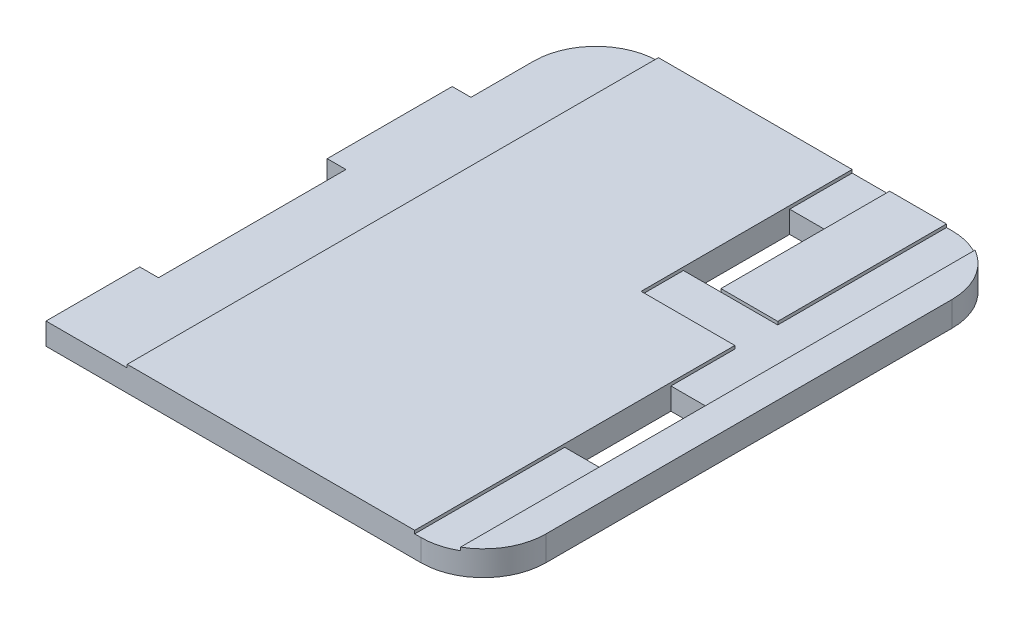
ISO-10303-21;
HEADER;
FILE_DESCRIPTION(('STEP AP214'),'2;1');
FILE_NAME('part.step','',(''),(''),'','','');
FILE_SCHEMA(('AUTOMOTIVE_DESIGN { 1 0 10303 214 1 1 1 1 }'));
ENDSEC;
DATA;
#1=APPLICATION_CONTEXT('core data for automotive mechanical design processes');
#2=APPLICATION_PROTOCOL_DEFINITION('international standard','automotive_design',2000,#1);
#3=PRODUCT_CONTEXT('',#1,'mechanical');
#4=PRODUCT('Part','Part','',(#3));
#5=PRODUCT_RELATED_PRODUCT_CATEGORY('part','',(#4));
#6=PRODUCT_DEFINITION_FORMATION('','',#4);
#7=PRODUCT_DEFINITION_CONTEXT('part definition',#1,'design');
#8=PRODUCT_DEFINITION('design','',#6,#7);
#9=PRODUCT_DEFINITION_SHAPE('','',#8);
#10=(LENGTH_UNIT() NAMED_UNIT(*) SI_UNIT(.MILLI.,.METRE.));
#11=(NAMED_UNIT(*) PLANE_ANGLE_UNIT() SI_UNIT($,.RADIAN.));
#12=(NAMED_UNIT(*) SI_UNIT($,.STERADIAN.) SOLID_ANGLE_UNIT());
#13=UNCERTAINTY_MEASURE_WITH_UNIT(LENGTH_MEASURE(1.E-05),#10,'distance_accuracy_value','');
#14=(GEOMETRIC_REPRESENTATION_CONTEXT(3) GLOBAL_UNCERTAINTY_ASSIGNED_CONTEXT((#13)) GLOBAL_UNIT_ASSIGNED_CONTEXT((#10,
#11,#12)) REPRESENTATION_CONTEXT('',''));
#15=CARTESIAN_POINT('',(0.,0.,0.));
#16=DIRECTION('',(0.,0.,1.));
#17=DIRECTION('',(1.,0.,0.));
#18=AXIS2_PLACEMENT_3D('',#15,#16,#17);
#19=CARTESIAN_POINT('',(0.,0.4,0.));
#20=DIRECTION('',(0.,1.,0.));
#21=DIRECTION('',(0.,0.,1.));
#22=AXIS2_PLACEMENT_3D('',#19,#20,#21);
#23=PLANE('',#22);
#24=DIRECTION('',(0.,0.,-1.));
#25=VECTOR('',#24,1.);
#26=CARTESIAN_POINT('',(1.3,0.4,-8.5));
#27=LINE('',#26,#25);
#28=CARTESIAN_POINT('',(1.3,0.4,0.));
#29=VERTEX_POINT('',#28);
#30=CARTESIAN_POINT('',(1.3,0.4,-8.5));
#31=VERTEX_POINT('',#30);
#32=EDGE_CURVE('E253',#29,#31,#27,.T.);
#33=ORIENTED_EDGE('',*,*,#32,.F.);
#34=DIRECTION('',(1.,0.,0.));
#35=VECTOR('',#34,1.);
#36=CARTESIAN_POINT('',(0.,0.4,0.));
#37=LINE('',#36,#35);
#38=CARTESIAN_POINT('',(5.9,0.4,0.));
#39=VERTEX_POINT('',#38);
#40=EDGE_CURVE('E267',#29,#39,#37,.T.);
#41=ORIENTED_EDGE('',*,*,#40,.T.);
#42=DIRECTION('',(0.,0.,1.));
#43=VECTOR('',#42,1.);
#44=CARTESIAN_POINT('',(5.9,0.4,-2.4));
#45=LINE('',#44,#43);
#46=CARTESIAN_POINT('',(5.9,0.4,-5.12304713782008));
#47=VERTEX_POINT('',#46);
#48=EDGE_CURVE('E357',#47,#39,#45,.T.);
#49=ORIENTED_EDGE('',*,*,#48,.F.);
#50=DIRECTION('',(1.,0.,0.));
#51=VECTOR('',#50,1.);
#52=CARTESIAN_POINT('',(5.9,0.4,-5.12304713782008));
#53=LINE('',#52,#51);
#54=CARTESIAN_POINT('',(4.4,0.4,-5.12304713782008));
#55=VERTEX_POINT('',#54);
#56=EDGE_CURVE('E298',#55,#47,#53,.T.);
#57=ORIENTED_EDGE('',*,*,#56,.F.);
#58=DIRECTION('',(0.,0.,1.));
#59=VECTOR('',#58,1.);
#60=CARTESIAN_POINT('',(4.4,0.4,-7.5));
#61=LINE('',#60,#59);
#62=CARTESIAN_POINT('',(4.4,0.4,-8.5));
#63=VERTEX_POINT('',#62);
#64=EDGE_CURVE('E381',#63,#55,#61,.T.);
#65=ORIENTED_EDGE('',*,*,#64,.F.);
#66=DIRECTION('',(-1.,0.,0.));
#67=VECTOR('',#66,1.);
#68=CARTESIAN_POINT('',(7.,0.4,-8.5));
#69=LINE('',#68,#67);
#70=EDGE_CURVE('E411',#63,#31,#69,.T.);
#71=ORIENTED_EDGE('',*,*,#70,.T.);
#72=EDGE_LOOP('',(#33,#41,#49,#57,#65,#71));
#73=FACE_BOUND('',#72,.T.);
#74=ADVANCED_FACE('F35',(#73),#23,.T.);
#75=CARTESIAN_POINT('',(5.90945528330629,0.4,-8.5));
#76=VERTEX_POINT('',#75);
#77=CARTESIAN_POINT('',(5.,0.4,-8.5));
#78=VERTEX_POINT('',#77);
#79=EDGE_CURVE('E414',#76,#78,#69,.T.);
#80=ORIENTED_EDGE('',*,*,#79,.T.);
#81=DIRECTION('',(0.,0.,-1.));
#82=VECTOR('',#81,1.);
#83=CARTESIAN_POINT('',(5.,0.4,-7.5));
#84=LINE('',#83,#82);
#85=CARTESIAN_POINT('',(5.,0.4,-5.8));
#86=VERTEX_POINT('',#85);
#87=EDGE_CURVE('E383',#86,#78,#84,.T.);
#88=ORIENTED_EDGE('',*,*,#87,.F.);
#89=DIRECTION('',(-1.,0.,0.));
#90=VECTOR('',#89,1.);
#91=CARTESIAN_POINT('',(5.,0.4,-5.8));
#92=LINE('',#91,#90);
#93=CARTESIAN_POINT('',(5.90945528330629,0.4,-5.8));
#94=VERTEX_POINT('',#93);
#95=EDGE_CURVE('E275',#94,#86,#92,.T.);
#96=ORIENTED_EDGE('',*,*,#95,.F.);
#97=DIRECTION('',(0.,0.,1.));
#98=VECTOR('',#97,1.);
#99=CARTESIAN_POINT('',(5.90945528330629,0.4,-5.8));
#100=LINE('',#99,#98);
#101=EDGE_CURVE('E301',#76,#94,#100,.T.);
#102=ORIENTED_EDGE('',*,*,#101,.F.);
#103=EDGE_LOOP('',(#80,#88,#96,#102));
#104=FACE_BOUND('',#103,.T.);
#105=ADVANCED_FACE('F581',(#104),#23,.T.);
#106=DIRECTION('',(0.,0.,-1.));
#107=VECTOR('',#106,1.);
#108=CARTESIAN_POINT('',(6.5,0.4,-2.4));
#109=LINE('',#108,#107);
#110=CARTESIAN_POINT('',(6.5,0.4,-0.133974596215561));
#111=VERTEX_POINT('',#110);
#112=CARTESIAN_POINT('',(6.5,0.4,-8.36602540378444));
#113=VERTEX_POINT('',#112);
#114=EDGE_CURVE('E359',#111,#113,#109,.T.);
#115=ORIENTED_EDGE('',*,*,#114,.F.);
#116=CARTESIAN_POINT('',(6.,0.4,-1.));
#117=DIRECTION('',(0.,1.,0.));
#118=DIRECTION('',(0.,0.,1.));
#119=AXIS2_PLACEMENT_3D('',#116,#117,#118);
#120=CIRCLE('',#119,1.);
#121=CARTESIAN_POINT('',(7.,0.4,-1.));
#122=VERTEX_POINT('',#121);
#123=EDGE_CURVE('E474',#111,#122,#120,.T.);
#124=ORIENTED_EDGE('',*,*,#123,.T.);
#125=DIRECTION('',(0.,0.,-1.));
#126=VECTOR('',#125,1.);
#127=CARTESIAN_POINT('',(7.,0.4,0.));
#128=LINE('',#127,#126);
#129=CARTESIAN_POINT('',(7.,0.4,-7.5));
#130=VERTEX_POINT('',#129);
#131=EDGE_CURVE('E407',#122,#130,#128,.T.);
#132=ORIENTED_EDGE('',*,*,#131,.T.);
#133=CARTESIAN_POINT('',(6.,0.4,-7.5));
#134=DIRECTION('',(0.,1.,0.));
#135=DIRECTION('',(0.,0.,1.));
#136=AXIS2_PLACEMENT_3D('',#133,#134,#135);
#137=CIRCLE('',#136,1.);
#138=EDGE_CURVE('E471',#130,#113,#137,.T.);
#139=ORIENTED_EDGE('',*,*,#138,.T.);
#140=EDGE_LOOP('',(#115,#124,#132,#139));
#141=FACE_BOUND('',#140,.T.);
#142=ADVANCED_FACE('F549',(#141),#23,.T.);
#143=CARTESIAN_POINT('',(0.,0.,0.));
#144=DIRECTION('',(0.,1.,0.));
#145=DIRECTION('',(0.,0.,1.));
#146=AXIS2_PLACEMENT_3D('',#143,#144,#145);
#147=PLANE('',#146);
#148=DIRECTION('',(0.,0.,1.));
#149=VECTOR('',#148,1.);
#150=CARTESIAN_POINT('',(4.4,0.,-7.5));
#151=LINE('',#150,#149);
#152=CARTESIAN_POINT('',(4.4,0.,-7.5));
#153=VERTEX_POINT('',#152);
#154=CARTESIAN_POINT('',(4.4,0.,-5.8));
#155=VERTEX_POINT('',#154);
#156=EDGE_CURVE('E380',#153,#155,#151,.T.);
#157=ORIENTED_EDGE('',*,*,#156,.T.);
#158=DIRECTION('',(1.,0.,0.));
#159=VECTOR('',#158,1.);
#160=CARTESIAN_POINT('',(4.4,0.,-5.8));
#161=LINE('',#160,#159);
#162=CARTESIAN_POINT('',(5.,0.,-5.8));
#163=VERTEX_POINT('',#162);
#164=EDGE_CURVE('E389',#155,#163,#161,.T.);
#165=ORIENTED_EDGE('',*,*,#164,.T.);
#166=DIRECTION('',(0.,0.,-1.));
#167=VECTOR('',#166,1.);
#168=CARTESIAN_POINT('',(5.,0.,-7.5));
#169=LINE('',#168,#167);
#170=CARTESIAN_POINT('',(5.,0.,-7.5));
#171=VERTEX_POINT('',#170);
#172=EDGE_CURVE('E392',#163,#171,#169,.T.);
#173=ORIENTED_EDGE('',*,*,#172,.T.);
#174=DIRECTION('',(-1.,0.,0.));
#175=VECTOR('',#174,1.);
#176=CARTESIAN_POINT('',(4.4,0.,-7.5));
#177=LINE('',#176,#175);
#178=EDGE_CURVE('E384',#171,#153,#177,.T.);
#179=ORIENTED_EDGE('',*,*,#178,.T.);
#180=EDGE_LOOP('',(#157,#165,#173,#179));
#181=FACE_BOUND('',#180,.T.);
#182=DIRECTION('',(0.,0.,-1.));
#183=VECTOR('',#182,1.);
#184=CARTESIAN_POINT('',(7.,0.,0.));
#185=LINE('',#184,#183);
#186=CARTESIAN_POINT('',(7.,0.,-1.));
#187=VERTEX_POINT('',#186);
#188=CARTESIAN_POINT('',(7.,0.,-7.5));
#189=VERTEX_POINT('',#188);
#190=EDGE_CURVE('E420',#187,#189,#185,.T.);
#191=ORIENTED_EDGE('',*,*,#190,.F.);
#192=CARTESIAN_POINT('',(6.,0.,-1.));
#193=DIRECTION('',(0.,1.,0.));
#194=DIRECTION('',(0.,0.,1.));
#195=AXIS2_PLACEMENT_3D('',#192,#193,#194);
#196=CIRCLE('',#195,1.);
#197=CARTESIAN_POINT('',(6.,0.,0.));
#198=VERTEX_POINT('',#197);
#199=EDGE_CURVE('E466',#187,#198,#196,.F.);
#200=ORIENTED_EDGE('',*,*,#199,.T.);
#201=DIRECTION('',(1.,0.,0.));
#202=VECTOR('',#201,1.);
#203=CARTESIAN_POINT('',(0.,0.,0.));
#204=LINE('',#203,#202);
#205=CARTESIAN_POINT('',(0.,0.,0.));
#206=VERTEX_POINT('',#205);
#207=EDGE_CURVE('E417',#206,#198,#204,.T.);
#208=ORIENTED_EDGE('',*,*,#207,.F.);
#209=DIRECTION('',(0.,0.,1.));
#210=VECTOR('',#209,1.);
#211=CARTESIAN_POINT('',(0.,0.,-1.5));
#212=LINE('',#211,#210);
#213=CARTESIAN_POINT('',(0.,0.,-1.5));
#214=VERTEX_POINT('',#213);
#215=EDGE_CURVE('E405',#214,#206,#212,.T.);
#216=ORIENTED_EDGE('',*,*,#215,.F.);
#217=DIRECTION('',(-1.,0.,0.));
#218=VECTOR('',#217,1.);
#219=CARTESIAN_POINT('',(0.3,0.,-1.5));
#220=LINE('',#219,#218);
#221=CARTESIAN_POINT('',(0.3,0.,-1.5));
#222=VERTEX_POINT('',#221);
#223=EDGE_CURVE('E408',#222,#214,#220,.T.);
#224=ORIENTED_EDGE('',*,*,#223,.F.);
#225=DIRECTION('',(0.,0.,1.));
#226=VECTOR('',#225,1.);
#227=CARTESIAN_POINT('',(0.3,0.,-4.5));
#228=LINE('',#227,#226);
#229=CARTESIAN_POINT('',(0.3,0.,-4.5));
#230=VERTEX_POINT('',#229);
#231=EDGE_CURVE('E438',#230,#222,#228,.T.);
#232=ORIENTED_EDGE('',*,*,#231,.F.);
#233=DIRECTION('',(1.,0.,0.));
#234=VECTOR('',#233,1.);
#235=CARTESIAN_POINT('',(0.,0.,-4.5));
#236=LINE('',#235,#234);
#237=CARTESIAN_POINT('',(0.,0.,-4.5));
#238=VERTEX_POINT('',#237);
#239=EDGE_CURVE('E435',#238,#230,#236,.T.);
#240=ORIENTED_EDGE('',*,*,#239,.F.);
#241=DIRECTION('',(0.,0.,1.));
#242=VECTOR('',#241,1.);
#243=CARTESIAN_POINT('',(0.,0.,-6.5));
#244=LINE('',#243,#242);
#245=CARTESIAN_POINT('',(0.,0.,-6.5));
#246=VERTEX_POINT('',#245);
#247=EDGE_CURVE('E432',#246,#238,#244,.T.);
#248=ORIENTED_EDGE('',*,*,#247,.F.);
#249=DIRECTION('',(-1.,0.,0.));
#250=VECTOR('',#249,1.);
#251=CARTESIAN_POINT('',(0.299999999999999,0.,-6.5));
#252=LINE('',#251,#250);
#253=CARTESIAN_POINT('',(0.299999999999999,0.,-6.5));
#254=VERTEX_POINT('',#253);
#255=EDGE_CURVE('E429',#254,#246,#252,.T.);
#256=ORIENTED_EDGE('',*,*,#255,.F.);
#257=DIRECTION('',(0.,0.,1.));
#258=VECTOR('',#257,1.);
#259=CARTESIAN_POINT('',(0.299999999999999,0.,-8.5));
#260=LINE('',#259,#258);
#261=CARTESIAN_POINT('',(0.299999999999999,0.,-7.5));
#262=VERTEX_POINT('',#261);
#263=EDGE_CURVE('E426',#262,#254,#260,.T.);
#264=ORIENTED_EDGE('',*,*,#263,.F.);
#265=CARTESIAN_POINT('',(1.3,0.,-7.5));
#266=DIRECTION('',(0.,1.,0.));
#267=DIRECTION('',(0.,0.,1.));
#268=AXIS2_PLACEMENT_3D('',#265,#266,#267);
#269=CIRCLE('',#268,1.);
#270=CARTESIAN_POINT('',(1.3,0.,-8.5));
#271=VERTEX_POINT('',#270);
#272=EDGE_CURVE('E462',#262,#271,#269,.F.);
#273=ORIENTED_EDGE('',*,*,#272,.T.);
#274=DIRECTION('',(-1.,0.,0.));
#275=VECTOR('',#274,1.);
#276=CARTESIAN_POINT('',(7.,0.,-8.5));
#277=LINE('',#276,#275);
#278=CARTESIAN_POINT('',(6.,0.,-8.5));
#279=VERTEX_POINT('',#278);
#280=EDGE_CURVE('E423',#279,#271,#277,.T.);
#281=ORIENTED_EDGE('',*,*,#280,.F.);
#282=CARTESIAN_POINT('',(6.,0.,-7.5));
#283=DIRECTION('',(0.,1.,0.));
#284=DIRECTION('',(0.,0.,1.));
#285=AXIS2_PLACEMENT_3D('',#282,#283,#284);
#286=CIRCLE('',#285,1.);
#287=EDGE_CURVE('E464',#279,#189,#286,.F.);
#288=ORIENTED_EDGE('',*,*,#287,.T.);
#289=EDGE_LOOP('',(#191,#200,#208,#216,#224,#232,#240,#248,#256,#264,#273,#281,#288));
#290=FACE_BOUND('',#289,.T.);
#291=DIRECTION('',(0.,0.,1.));
#292=VECTOR('',#291,1.);
#293=CARTESIAN_POINT('',(5.9,0.,-2.4));
#294=LINE('',#293,#292);
#295=CARTESIAN_POINT('',(5.9,0.,-4.1));
#296=VERTEX_POINT('',#295);
#297=CARTESIAN_POINT('',(5.9,0.,-2.4));
#298=VERTEX_POINT('',#297);
#299=EDGE_CURVE('E356',#296,#298,#294,.T.);
#300=ORIENTED_EDGE('',*,*,#299,.T.);
#301=DIRECTION('',(1.,0.,0.));
#302=VECTOR('',#301,1.);
#303=CARTESIAN_POINT('',(5.9,0.,-2.4));
#304=LINE('',#303,#302);
#305=CARTESIAN_POINT('',(6.5,0.,-2.4));
#306=VERTEX_POINT('',#305);
#307=EDGE_CURVE('E365',#298,#306,#304,.T.);
#308=ORIENTED_EDGE('',*,*,#307,.T.);
#309=DIRECTION('',(0.,0.,-1.));
#310=VECTOR('',#309,1.);
#311=CARTESIAN_POINT('',(6.5,0.,-2.4));
#312=LINE('',#311,#310);
#313=CARTESIAN_POINT('',(6.5,0.,-4.1));
#314=VERTEX_POINT('',#313);
#315=EDGE_CURVE('E368',#306,#314,#312,.T.);
#316=ORIENTED_EDGE('',*,*,#315,.T.);
#317=DIRECTION('',(-1.,0.,0.));
#318=VECTOR('',#317,1.);
#319=CARTESIAN_POINT('',(5.9,0.,-4.1));
#320=LINE('',#319,#318);
#321=EDGE_CURVE('E360',#314,#296,#320,.T.);
#322=ORIENTED_EDGE('',*,*,#321,.T.);
#323=EDGE_LOOP('',(#300,#308,#316,#322));
#324=FACE_BOUND('',#323,.T.);
#325=ADVANCED_FACE('F505',(#181,#290,#324),#147,.F.);
#326=CARTESIAN_POINT('',(0.,0.4,-1.5));
#327=DIRECTION('',(1.,0.,0.));
#328=DIRECTION('',(0.,0.,-1.));
#329=AXIS2_PLACEMENT_3D('',#326,#327,#328);
#330=PLANE('',#329);
#331=DIRECTION('',(0.,-1.,0.));
#332=VECTOR('',#331,1.);
#333=CARTESIAN_POINT('',(0.,0.4,0.));
#334=LINE('',#333,#332);
#335=CARTESIAN_POINT('',(0.,0.35,0.));
#336=VERTEX_POINT('',#335);
#337=EDGE_CURVE('E455',#336,#206,#334,.T.);
#338=ORIENTED_EDGE('',*,*,#337,.F.);
#339=DIRECTION('',(0.,0.,-1.));
#340=VECTOR('',#339,1.);
#341=CARTESIAN_POINT('',(0.,0.35,-1.5));
#342=LINE('',#341,#340);
#343=CARTESIAN_POINT('',(0.,0.35,-1.5));
#344=VERTEX_POINT('',#343);
#345=EDGE_CURVE('E249',#336,#344,#342,.T.);
#346=ORIENTED_EDGE('',*,*,#345,.T.);
#347=DIRECTION('',(0.,-1.,0.));
#348=VECTOR('',#347,1.);
#349=CARTESIAN_POINT('',(0.,0.4,-1.5));
#350=LINE('',#349,#348);
#351=EDGE_CURVE('E443',#344,#214,#350,.T.);
#352=ORIENTED_EDGE('',*,*,#351,.T.);
#353=ORIENTED_EDGE('',*,*,#215,.T.);
#354=EDGE_LOOP('',(#338,#346,#352,#353));
#355=FACE_BOUND('',#354,.T.);
#356=ADVANCED_FACE('F537',(#355),#330,.F.);
#357=CARTESIAN_POINT('',(0.,0.4,0.));
#358=DIRECTION('',(0.,0.,-1.));
#359=DIRECTION('',(-1.,0.,0.));
#360=AXIS2_PLACEMENT_3D('',#357,#358,#359);
#361=PLANE('',#360);
#362=ORIENTED_EDGE('',*,*,#40,.F.);
#363=DIRECTION('',(0.,1.,0.));
#364=VECTOR('',#363,1.);
#365=CARTESIAN_POINT('',(1.3,0.35,0.));
#366=LINE('',#365,#364);
#367=CARTESIAN_POINT('',(1.3,0.35,0.));
#368=VERTEX_POINT('',#367);
#369=EDGE_CURVE('E257',#368,#29,#366,.T.);
#370=ORIENTED_EDGE('',*,*,#369,.F.);
#371=DIRECTION('',(1.,0.,0.));
#372=VECTOR('',#371,1.);
#373=CARTESIAN_POINT('',(1.3,0.35,0.));
#374=LINE('',#373,#372);
#375=EDGE_CURVE('E243',#336,#368,#374,.T.);
#376=ORIENTED_EDGE('',*,*,#375,.F.);
#377=ORIENTED_EDGE('',*,*,#337,.T.);
#378=ORIENTED_EDGE('',*,*,#207,.T.);
#379=DIRECTION('',(0.,-1.,0.));
#380=VECTOR('',#379,1.);
#381=CARTESIAN_POINT('',(6.,0.4,0.));
#382=LINE('',#381,#380);
#383=CARTESIAN_POINT('',(6.,0.35,0.));
#384=VERTEX_POINT('',#383);
#385=EDGE_CURVE('E468',#198,#384,#382,.F.);
#386=ORIENTED_EDGE('',*,*,#385,.T.);
#387=DIRECTION('',(1.,0.,0.));
#388=VECTOR('',#387,1.);
#389=CARTESIAN_POINT('',(6.5,0.35,0.));
#390=LINE('',#389,#388);
#391=CARTESIAN_POINT('',(5.9,0.35,0.));
#392=VERTEX_POINT('',#391);
#393=EDGE_CURVE('E58',#392,#384,#390,.T.);
#394=ORIENTED_EDGE('',*,*,#393,.F.);
#395=DIRECTION('',(0.,1.,0.));
#396=VECTOR('',#395,1.);
#397=CARTESIAN_POINT('',(5.9,0.35,0.));
#398=LINE('',#397,#396);
#399=EDGE_CURVE('E309',#392,#39,#398,.T.);
#400=ORIENTED_EDGE('',*,*,#399,.T.);
#401=EDGE_LOOP('',(#362,#370,#376,#377,#378,#386,#394,#400));
#402=FACE_BOUND('',#401,.T.);
#403=ADVANCED_FACE('F264',(#402),#361,.F.);
#404=CARTESIAN_POINT('',(7.,0.4,0.));
#405=DIRECTION('',(-1.,0.,0.));
#406=DIRECTION('',(0.,0.,1.));
#407=AXIS2_PLACEMENT_3D('',#404,#405,#406);
#408=PLANE('',#407);
#409=ORIENTED_EDGE('',*,*,#131,.F.);
#410=DIRECTION('',(0.,-1.,0.));
#411=VECTOR('',#410,1.);
#412=CARTESIAN_POINT('',(7.,0.4,-1.));
#413=LINE('',#412,#411);
#414=EDGE_CURVE('E459',#122,#187,#413,.T.);
#415=ORIENTED_EDGE('',*,*,#414,.T.);
#416=ORIENTED_EDGE('',*,*,#190,.T.);
#417=DIRECTION('',(0.,-1.,0.));
#418=VECTOR('',#417,1.);
#419=CARTESIAN_POINT('',(7.,0.4,-7.5));
#420=LINE('',#419,#418);
#421=EDGE_CURVE('E457',#189,#130,#420,.F.);
#422=ORIENTED_EDGE('',*,*,#421,.T.);
#423=EDGE_LOOP('',(#409,#415,#416,#422));
#424=FACE_BOUND('',#423,.T.);
#425=ADVANCED_FACE('F547',(#424),#408,.F.);
#426=CARTESIAN_POINT('',(7.,0.4,-8.5));
#427=DIRECTION('',(0.,0.,1.));
#428=DIRECTION('',(1.,0.,0.));
#429=AXIS2_PLACEMENT_3D('',#426,#427,#428);
#430=PLANE('',#429);
#431=ORIENTED_EDGE('',*,*,#70,.F.);
#432=DIRECTION('',(0.,-1.,0.));
#433=VECTOR('',#432,1.);
#434=CARTESIAN_POINT('',(4.4,0.4,-8.5));
#435=LINE('',#434,#433);
#436=CARTESIAN_POINT('',(4.4,0.35,-8.5));
#437=VERTEX_POINT('',#436);
#438=EDGE_CURVE('E353',#63,#437,#435,.T.);
#439=ORIENTED_EDGE('',*,*,#438,.T.);
#440=DIRECTION('',(1.,0.,0.));
#441=VECTOR('',#440,1.);
#442=CARTESIAN_POINT('',(7.,0.35,-8.5));
#443=LINE('',#442,#441);
#444=CARTESIAN_POINT('',(5.,0.35,-8.5));
#445=VERTEX_POINT('',#444);
#446=EDGE_CURVE('E344',#437,#445,#443,.T.);
#447=ORIENTED_EDGE('',*,*,#446,.T.);
#448=DIRECTION('',(0.,1.,0.));
#449=VECTOR('',#448,1.);
#450=CARTESIAN_POINT('',(5.,0.4,-8.5));
#451=LINE('',#450,#449);
#452=EDGE_CURVE('E350',#445,#78,#451,.T.);
#453=ORIENTED_EDGE('',*,*,#452,.T.);
#454=ORIENTED_EDGE('',*,*,#79,.F.);
#455=DIRECTION('',(0.,1.,0.));
#456=VECTOR('',#455,1.);
#457=CARTESIAN_POINT('',(5.90945528330629,0.35,-8.5));
#458=LINE('',#457,#456);
#459=CARTESIAN_POINT('',(5.90945528330629,0.35,-8.5));
#460=VERTEX_POINT('',#459);
#461=EDGE_CURVE('E307',#460,#76,#458,.T.);
#462=ORIENTED_EDGE('',*,*,#461,.F.);
#463=DIRECTION('',(-1.,0.,0.));
#464=VECTOR('',#463,1.);
#465=CARTESIAN_POINT('',(5.90945528330629,0.35,-8.5));
#466=LINE('',#465,#464);
#467=CARTESIAN_POINT('',(6.,0.35,-8.5));
#468=VERTEX_POINT('',#467);
#469=EDGE_CURVE('E286',#468,#460,#466,.T.);
#470=ORIENTED_EDGE('',*,*,#469,.F.);
#471=DIRECTION('',(0.,-1.,0.));
#472=VECTOR('',#471,1.);
#473=CARTESIAN_POINT('',(6.,0.4,-8.5));
#474=LINE('',#473,#472);
#475=EDGE_CURVE('E479',#468,#279,#474,.T.);
#476=ORIENTED_EDGE('',*,*,#475,.T.);
#477=ORIENTED_EDGE('',*,*,#280,.T.);
#478=DIRECTION('',(0.,-1.,0.));
#479=VECTOR('',#478,1.);
#480=CARTESIAN_POINT('',(1.3,0.4,-8.5));
#481=LINE('',#480,#479);
#482=CARTESIAN_POINT('',(1.3,0.35,-8.5));
#483=VERTEX_POINT('',#482);
#484=EDGE_CURVE('E476',#271,#483,#481,.F.);
#485=ORIENTED_EDGE('',*,*,#484,.T.);
#486=DIRECTION('',(0.,1.,0.));
#487=VECTOR('',#486,1.);
#488=CARTESIAN_POINT('',(1.3,0.35,-8.5));
#489=LINE('',#488,#487);
#490=EDGE_CURVE('E260',#483,#31,#489,.T.);
#491=ORIENTED_EDGE('',*,*,#490,.T.);
#492=EDGE_LOOP('',(#431,#439,#447,#453,#454,#462,#470,#476,#477,#485,#491));
#493=FACE_BOUND('',#492,.T.);
#494=ADVANCED_FACE('F496',(#493),#430,.F.);
#495=CARTESIAN_POINT('',(0.299999999999999,0.4,-8.5));
#496=DIRECTION('',(1.,0.,0.));
#497=DIRECTION('',(0.,0.,-1.));
#498=AXIS2_PLACEMENT_3D('',#495,#496,#497);
#499=PLANE('',#498);
#500=DIRECTION('',(0.,-1.,0.));
#501=VECTOR('',#500,1.);
#502=CARTESIAN_POINT('',(0.299999999999999,0.4,-6.5));
#503=LINE('',#502,#501);
#504=CARTESIAN_POINT('',(0.299999999999999,0.35,-6.5));
#505=VERTEX_POINT('',#504);
#506=EDGE_CURVE('E453',#505,#254,#503,.T.);
#507=ORIENTED_EDGE('',*,*,#506,.F.);
#508=DIRECTION('',(0.,0.,-1.));
#509=VECTOR('',#508,1.);
#510=CARTESIAN_POINT('',(0.299999999999999,0.35,-8.5));
#511=LINE('',#510,#509);
#512=CARTESIAN_POINT('',(0.299999999999999,0.35,-7.5));
#513=VERTEX_POINT('',#512);
#514=EDGE_CURVE('E269',#505,#513,#511,.T.);
#515=ORIENTED_EDGE('',*,*,#514,.T.);
#516=DIRECTION('',(0.,-1.,0.));
#517=VECTOR('',#516,1.);
#518=CARTESIAN_POINT('',(0.299999999999999,0.4,-7.5));
#519=LINE('',#518,#517);
#520=EDGE_CURVE('E481',#513,#262,#519,.T.);
#521=ORIENTED_EDGE('',*,*,#520,.T.);
#522=ORIENTED_EDGE('',*,*,#263,.T.);
#523=EDGE_LOOP('',(#507,#515,#521,#522));
#524=FACE_BOUND('',#523,.T.);
#525=ADVANCED_FACE('F514',(#524),#499,.F.);
#526=CARTESIAN_POINT('',(0.299999999999999,0.4,-6.5));
#527=DIRECTION('',(0.,0.,1.));
#528=DIRECTION('',(1.,0.,0.));
#529=AXIS2_PLACEMENT_3D('',#526,#527,#528);
#530=PLANE('',#529);
#531=DIRECTION('',(0.,-1.,0.));
#532=VECTOR('',#531,1.);
#533=CARTESIAN_POINT('',(0.,0.4,-6.5));
#534=LINE('',#533,#532);
#535=CARTESIAN_POINT('',(0.,0.35,-6.5));
#536=VERTEX_POINT('',#535);
#537=EDGE_CURVE('E451',#536,#246,#534,.T.);
#538=ORIENTED_EDGE('',*,*,#537,.F.);
#539=DIRECTION('',(1.,0.,0.));
#540=VECTOR('',#539,1.);
#541=CARTESIAN_POINT('',(0.299999999999999,0.35,-6.5));
#542=LINE('',#541,#540);
#543=EDGE_CURVE('E318',#536,#505,#542,.T.);
#544=ORIENTED_EDGE('',*,*,#543,.T.);
#545=ORIENTED_EDGE('',*,*,#506,.T.);
#546=ORIENTED_EDGE('',*,*,#255,.T.);
#547=EDGE_LOOP('',(#538,#544,#545,#546));
#548=FACE_BOUND('',#547,.T.);
#549=ADVANCED_FACE('F518',(#548),#530,.F.);
#550=CARTESIAN_POINT('',(0.,0.4,-6.5));
#551=DIRECTION('',(1.,0.,0.));
#552=DIRECTION('',(0.,0.,-1.));
#553=AXIS2_PLACEMENT_3D('',#550,#551,#552);
#554=PLANE('',#553);
#555=DIRECTION('',(0.,-1.,0.));
#556=VECTOR('',#555,1.);
#557=CARTESIAN_POINT('',(0.,0.4,-4.5));
#558=LINE('',#557,#556);
#559=CARTESIAN_POINT('',(0.,0.35,-4.5));
#560=VERTEX_POINT('',#559);
#561=EDGE_CURVE('E449',#560,#238,#558,.T.);
#562=ORIENTED_EDGE('',*,*,#561,.F.);
#563=DIRECTION('',(0.,0.,-1.));
#564=VECTOR('',#563,1.);
#565=CARTESIAN_POINT('',(0.,0.35,-6.5));
#566=LINE('',#565,#564);
#567=EDGE_CURVE('E321',#560,#536,#566,.T.);
#568=ORIENTED_EDGE('',*,*,#567,.T.);
#569=ORIENTED_EDGE('',*,*,#537,.T.);
#570=ORIENTED_EDGE('',*,*,#247,.T.);
#571=EDGE_LOOP('',(#562,#568,#569,#570));
#572=FACE_BOUND('',#571,.T.);
#573=ADVANCED_FACE('F522',(#572),#554,.F.);
#574=CARTESIAN_POINT('',(0.,0.4,-4.5));
#575=DIRECTION('',(0.,0.,-1.));
#576=DIRECTION('',(-1.,0.,0.));
#577=AXIS2_PLACEMENT_3D('',#574,#575,#576);
#578=PLANE('',#577);
#579=DIRECTION('',(0.,-1.,0.));
#580=VECTOR('',#579,1.);
#581=CARTESIAN_POINT('',(0.3,0.4,-4.5));
#582=LINE('',#581,#580);
#583=CARTESIAN_POINT('',(0.3,0.35,-4.5));
#584=VERTEX_POINT('',#583);
#585=EDGE_CURVE('E447',#584,#230,#582,.T.);
#586=ORIENTED_EDGE('',*,*,#585,.F.);
#587=DIRECTION('',(-1.,0.,0.));
#588=VECTOR('',#587,1.);
#589=CARTESIAN_POINT('',(0.,0.35,-4.5));
#590=LINE('',#589,#588);
#591=EDGE_CURVE('E324',#584,#560,#590,.T.);
#592=ORIENTED_EDGE('',*,*,#591,.T.);
#593=ORIENTED_EDGE('',*,*,#561,.T.);
#594=ORIENTED_EDGE('',*,*,#239,.T.);
#595=EDGE_LOOP('',(#586,#592,#593,#594));
#596=FACE_BOUND('',#595,.T.);
#597=ADVANCED_FACE('F526',(#596),#578,.F.);
#598=CARTESIAN_POINT('',(0.3,0.4,-4.5));
#599=DIRECTION('',(1.,0.,0.));
#600=DIRECTION('',(0.,0.,-1.));
#601=AXIS2_PLACEMENT_3D('',#598,#599,#600);
#602=PLANE('',#601);
#603=DIRECTION('',(0.,-1.,0.));
#604=VECTOR('',#603,1.);
#605=CARTESIAN_POINT('',(0.3,0.4,-1.5));
#606=LINE('',#605,#604);
#607=CARTESIAN_POINT('',(0.3,0.35,-1.5));
#608=VERTEX_POINT('',#607);
#609=EDGE_CURVE('E445',#608,#222,#606,.T.);
#610=ORIENTED_EDGE('',*,*,#609,.F.);
#611=DIRECTION('',(0.,0.,-1.));
#612=VECTOR('',#611,1.);
#613=CARTESIAN_POINT('',(0.3,0.35,-4.5));
#614=LINE('',#613,#612);
#615=EDGE_CURVE('E327',#608,#584,#614,.T.);
#616=ORIENTED_EDGE('',*,*,#615,.T.);
#617=ORIENTED_EDGE('',*,*,#585,.T.);
#618=ORIENTED_EDGE('',*,*,#231,.T.);
#619=EDGE_LOOP('',(#610,#616,#617,#618));
#620=FACE_BOUND('',#619,.T.);
#621=ADVANCED_FACE('F530',(#620),#602,.F.);
#622=CARTESIAN_POINT('',(0.3,0.4,-1.5));
#623=DIRECTION('',(0.,0.,1.));
#624=DIRECTION('',(1.,0.,0.));
#625=AXIS2_PLACEMENT_3D('',#622,#623,#624);
#626=PLANE('',#625);
#627=ORIENTED_EDGE('',*,*,#351,.F.);
#628=DIRECTION('',(1.,0.,0.));
#629=VECTOR('',#628,1.);
#630=CARTESIAN_POINT('',(0.3,0.35,-1.5));
#631=LINE('',#630,#629);
#632=EDGE_CURVE('E330',#344,#608,#631,.T.);
#633=ORIENTED_EDGE('',*,*,#632,.T.);
#634=ORIENTED_EDGE('',*,*,#609,.T.);
#635=ORIENTED_EDGE('',*,*,#223,.T.);
#636=EDGE_LOOP('',(#627,#633,#634,#635));
#637=FACE_BOUND('',#636,.T.);
#638=ADVANCED_FACE('F534',(#637),#626,.F.);
#639=CARTESIAN_POINT('',(4.4,0.4,-7.5));
#640=DIRECTION('',(1.,0.,0.));
#641=DIRECTION('',(0.,0.,-1.));
#642=AXIS2_PLACEMENT_3D('',#639,#640,#641);
#643=PLANE('',#642);
#644=DIRECTION('',(0.,-1.,0.));
#645=VECTOR('',#644,1.);
#646=CARTESIAN_POINT('',(4.4,0.4,-7.5));
#647=LINE('',#646,#645);
#648=CARTESIAN_POINT('',(4.4,0.35,-7.5));
#649=VERTEX_POINT('',#648);
#650=EDGE_CURVE('E386',#649,#153,#647,.T.);
#651=ORIENTED_EDGE('',*,*,#650,.F.);
#652=DIRECTION('',(0.,0.,1.));
#653=VECTOR('',#652,1.);
#654=CARTESIAN_POINT('',(4.4,0.35,-7.5));
#655=LINE('',#654,#653);
#656=EDGE_CURVE('E50',#437,#649,#655,.T.);
#657=ORIENTED_EDGE('',*,*,#656,.F.);
#658=ORIENTED_EDGE('',*,*,#438,.F.);
#659=ORIENTED_EDGE('',*,*,#64,.T.);
#660=DIRECTION('',(0.,1.,0.));
#661=VECTOR('',#660,1.);
#662=CARTESIAN_POINT('',(4.4,0.35,-5.12304713782008));
#663=LINE('',#662,#661);
#664=CARTESIAN_POINT('',(4.4,0.35,-5.12304713782008));
#665=VERTEX_POINT('',#664);
#666=EDGE_CURVE('E297',#665,#55,#663,.T.);
#667=ORIENTED_EDGE('',*,*,#666,.F.);
#668=CARTESIAN_POINT('',(4.4,0.35,-5.8));
#669=VERTEX_POINT('',#668);
#670=EDGE_CURVE('E273',#669,#665,#655,.T.);
#671=ORIENTED_EDGE('',*,*,#670,.F.);
#672=DIRECTION('',(0.,-1.,0.));
#673=VECTOR('',#672,1.);
#674=CARTESIAN_POINT('',(4.4,0.4,-5.8));
#675=LINE('',#674,#673);
#676=EDGE_CURVE('E403',#669,#155,#675,.T.);
#677=ORIENTED_EDGE('',*,*,#676,.T.);
#678=ORIENTED_EDGE('',*,*,#156,.F.);
#679=EDGE_LOOP('',(#651,#657,#658,#659,#667,#671,#677,#678));
#680=FACE_BOUND('',#679,.T.);
#681=ADVANCED_FACE('F563',(#680),#643,.T.);
#682=CARTESIAN_POINT('',(4.4,0.4,-5.8));
#683=DIRECTION('',(0.,0.,-1.));
#684=DIRECTION('',(-1.,0.,0.));
#685=AXIS2_PLACEMENT_3D('',#682,#683,#684);
#686=PLANE('',#685);
#687=DIRECTION('',(-1.,0.,0.));
#688=VECTOR('',#687,1.);
#689=CARTESIAN_POINT('',(4.4,0.35,-5.8));
#690=LINE('',#689,#688);
#691=CARTESIAN_POINT('',(5.,0.35,-5.8));
#692=VERTEX_POINT('',#691);
#693=EDGE_CURVE('E342',#692,#669,#690,.T.);
#694=ORIENTED_EDGE('',*,*,#693,.F.);
#695=DIRECTION('',(0.,-1.,0.));
#696=VECTOR('',#695,1.);
#697=CARTESIAN_POINT('',(5.,0.4,-5.8));
#698=LINE('',#697,#696);
#699=EDGE_CURVE('E400',#692,#163,#698,.T.);
#700=ORIENTED_EDGE('',*,*,#699,.T.);
#701=ORIENTED_EDGE('',*,*,#164,.F.);
#702=ORIENTED_EDGE('',*,*,#676,.F.);
#703=EDGE_LOOP('',(#694,#700,#701,#702));
#704=FACE_BOUND('',#703,.T.);
#705=ADVANCED_FACE('F591',(#704),#686,.T.);
#706=CARTESIAN_POINT('',(5.,0.4,-7.5));
#707=DIRECTION('',(-1.,0.,0.));
#708=DIRECTION('',(0.,0.,1.));
#709=AXIS2_PLACEMENT_3D('',#706,#707,#708);
#710=PLANE('',#709);
#711=ORIENTED_EDGE('',*,*,#699,.F.);
#712=EDGE_CURVE('E401',#86,#692,#698,.T.);
#713=ORIENTED_EDGE('',*,*,#712,.F.);
#714=ORIENTED_EDGE('',*,*,#87,.T.);
#715=ORIENTED_EDGE('',*,*,#452,.F.);
#716=DIRECTION('',(0.,0.,-1.));
#717=VECTOR('',#716,1.);
#718=CARTESIAN_POINT('',(5.,0.35,-7.5));
#719=LINE('',#718,#717);
#720=CARTESIAN_POINT('',(5.,0.35,-7.5));
#721=VERTEX_POINT('',#720);
#722=EDGE_CURVE('E294',#721,#445,#719,.T.);
#723=ORIENTED_EDGE('',*,*,#722,.F.);
#724=DIRECTION('',(0.,-1.,0.));
#725=VECTOR('',#724,1.);
#726=CARTESIAN_POINT('',(5.,0.4,-7.5));
#727=LINE('',#726,#725);
#728=EDGE_CURVE('E398',#721,#171,#727,.T.);
#729=ORIENTED_EDGE('',*,*,#728,.T.);
#730=ORIENTED_EDGE('',*,*,#172,.F.);
#731=EDGE_LOOP('',(#711,#713,#714,#715,#723,#729,#730));
#732=FACE_BOUND('',#731,.T.);
#733=ADVANCED_FACE('F574',(#732),#710,.T.);
#734=CARTESIAN_POINT('',(4.4,0.4,-7.5));
#735=DIRECTION('',(0.,0.,1.));
#736=DIRECTION('',(1.,0.,0.));
#737=AXIS2_PLACEMENT_3D('',#734,#735,#736);
#738=PLANE('',#737);
#739=DIRECTION('',(1.,0.,0.));
#740=VECTOR('',#739,1.);
#741=CARTESIAN_POINT('',(4.4,0.35,-7.5));
#742=LINE('',#741,#740);
#743=EDGE_CURVE('E340',#649,#721,#742,.T.);
#744=ORIENTED_EDGE('',*,*,#743,.F.);
#745=ORIENTED_EDGE('',*,*,#650,.T.);
#746=ORIENTED_EDGE('',*,*,#178,.F.);
#747=ORIENTED_EDGE('',*,*,#728,.F.);
#748=EDGE_LOOP('',(#744,#745,#746,#747));
#749=FACE_BOUND('',#748,.T.);
#750=ADVANCED_FACE('F568',(#749),#738,.T.);
#751=CARTESIAN_POINT('',(5.9,0.4,-2.4));
#752=DIRECTION('',(1.,0.,0.));
#753=DIRECTION('',(0.,0.,-1.));
#754=AXIS2_PLACEMENT_3D('',#751,#752,#753);
#755=PLANE('',#754);
#756=DIRECTION('',(0.,-1.,0.));
#757=VECTOR('',#756,1.);
#758=CARTESIAN_POINT('',(5.9,0.4,-4.1));
#759=LINE('',#758,#757);
#760=CARTESIAN_POINT('',(5.9,0.35,-4.1));
#761=VERTEX_POINT('',#760);
#762=EDGE_CURVE('E362',#761,#296,#759,.T.);
#763=ORIENTED_EDGE('',*,*,#762,.F.);
#764=DIRECTION('',(0.,0.,1.));
#765=VECTOR('',#764,1.);
#766=CARTESIAN_POINT('',(5.9,0.35,-4.1));
#767=LINE('',#766,#765);
#768=CARTESIAN_POINT('',(5.9,0.35,-5.12304713782008));
#769=VERTEX_POINT('',#768);
#770=EDGE_CURVE('E280',#769,#761,#767,.T.);
#771=ORIENTED_EDGE('',*,*,#770,.F.);
#772=DIRECTION('',(0.,1.,0.));
#773=VECTOR('',#772,1.);
#774=CARTESIAN_POINT('',(5.9,0.35,-5.12304713782008));
#775=LINE('',#774,#773);
#776=EDGE_CURVE('E311',#769,#47,#775,.T.);
#777=ORIENTED_EDGE('',*,*,#776,.T.);
#778=ORIENTED_EDGE('',*,*,#48,.T.);
#779=ORIENTED_EDGE('',*,*,#399,.F.);
#780=CARTESIAN_POINT('',(5.9,0.35,-2.4));
#781=VERTEX_POINT('',#780);
#782=EDGE_CURVE('E279',#781,#392,#767,.T.);
#783=ORIENTED_EDGE('',*,*,#782,.F.);
#784=DIRECTION('',(0.,-1.,0.));
#785=VECTOR('',#784,1.);
#786=CARTESIAN_POINT('',(5.9,0.4,-2.4));
#787=LINE('',#786,#785);
#788=EDGE_CURVE('E378',#781,#298,#787,.T.);
#789=ORIENTED_EDGE('',*,*,#788,.T.);
#790=ORIENTED_EDGE('',*,*,#299,.F.);
#791=EDGE_LOOP('',(#763,#771,#777,#778,#779,#783,#789,#790));
#792=FACE_BOUND('',#791,.T.);
#793=ADVANCED_FACE('F616',(#792),#755,.T.);
#794=CARTESIAN_POINT('',(5.9,0.4,-2.4));
#795=DIRECTION('',(0.,0.,-1.));
#796=DIRECTION('',(-1.,0.,0.));
#797=AXIS2_PLACEMENT_3D('',#794,#795,#796);
#798=PLANE('',#797);
#799=DIRECTION('',(-1.,0.,0.));
#800=VECTOR('',#799,1.);
#801=CARTESIAN_POINT('',(5.9,0.35,-2.4));
#802=LINE('',#801,#800);
#803=CARTESIAN_POINT('',(6.5,0.35,-2.4));
#804=VERTEX_POINT('',#803);
#805=EDGE_CURVE('E338',#804,#781,#802,.T.);
#806=ORIENTED_EDGE('',*,*,#805,.F.);
#807=DIRECTION('',(0.,-1.,0.));
#808=VECTOR('',#807,1.);
#809=CARTESIAN_POINT('',(6.5,0.4,-2.4));
#810=LINE('',#809,#808);
#811=EDGE_CURVE('E376',#804,#306,#810,.T.);
#812=ORIENTED_EDGE('',*,*,#811,.T.);
#813=ORIENTED_EDGE('',*,*,#307,.F.);
#814=ORIENTED_EDGE('',*,*,#788,.F.);
#815=EDGE_LOOP('',(#806,#812,#813,#814));
#816=FACE_BOUND('',#815,.T.);
#817=ADVANCED_FACE('F619',(#816),#798,.T.);
#818=CARTESIAN_POINT('',(6.5,0.4,-2.4));
#819=DIRECTION('',(-1.,0.,0.));
#820=DIRECTION('',(0.,0.,1.));
#821=AXIS2_PLACEMENT_3D('',#818,#819,#820);
#822=PLANE('',#821);
#823=ORIENTED_EDGE('',*,*,#811,.F.);
#824=DIRECTION('',(0.,0.,-1.));
#825=VECTOR('',#824,1.);
#826=CARTESIAN_POINT('',(6.5,0.35,-4.1));
#827=LINE('',#826,#825);
#828=CARTESIAN_POINT('',(6.5,0.35,-0.133974596215561));
#829=VERTEX_POINT('',#828);
#830=EDGE_CURVE('E285',#829,#804,#827,.T.);
#831=ORIENTED_EDGE('',*,*,#830,.F.);
#832=DIRECTION('',(0.,-1.,0.));
#833=VECTOR('',#832,1.);
#834=CARTESIAN_POINT('',(6.5,0.4,-0.133974596215561));
#835=LINE('',#834,#833);
#836=EDGE_CURVE('E347',#829,#111,#835,.F.);
#837=ORIENTED_EDGE('',*,*,#836,.T.);
#838=ORIENTED_EDGE('',*,*,#114,.T.);
#839=DIRECTION('',(0.,-1.,0.));
#840=VECTOR('',#839,1.);
#841=CARTESIAN_POINT('',(6.5,0.4,-8.36602540378444));
#842=LINE('',#841,#840);
#843=CARTESIAN_POINT('',(6.5,0.35,-8.36602540378444));
#844=VERTEX_POINT('',#843);
#845=EDGE_CURVE('E11',#113,#844,#842,.T.);
#846=ORIENTED_EDGE('',*,*,#845,.T.);
#847=CARTESIAN_POINT('',(6.5,0.35,-4.1));
#848=VERTEX_POINT('',#847);
#849=EDGE_CURVE('E283',#848,#844,#827,.T.);
#850=ORIENTED_EDGE('',*,*,#849,.F.);
#851=DIRECTION('',(0.,-1.,0.));
#852=VECTOR('',#851,1.);
#853=CARTESIAN_POINT('',(6.5,0.4,-4.1));
#854=LINE('',#853,#852);
#855=EDGE_CURVE('E374',#848,#314,#854,.T.);
#856=ORIENTED_EDGE('',*,*,#855,.T.);
#857=ORIENTED_EDGE('',*,*,#315,.F.);
#858=EDGE_LOOP('',(#823,#831,#837,#838,#846,#850,#856,#857));
#859=FACE_BOUND('',#858,.T.);
#860=ADVANCED_FACE('F552',(#859),#822,.T.);
#861=CARTESIAN_POINT('',(5.9,0.4,-4.1));
#862=DIRECTION('',(0.,0.,1.));
#863=DIRECTION('',(1.,0.,0.));
#864=AXIS2_PLACEMENT_3D('',#861,#862,#863);
#865=PLANE('',#864);
#866=DIRECTION('',(1.,0.,0.));
#867=VECTOR('',#866,1.);
#868=CARTESIAN_POINT('',(5.9,0.35,-4.1));
#869=LINE('',#868,#867);
#870=EDGE_CURVE('E336',#761,#848,#869,.T.);
#871=ORIENTED_EDGE('',*,*,#870,.F.);
#872=ORIENTED_EDGE('',*,*,#762,.T.);
#873=ORIENTED_EDGE('',*,*,#321,.F.);
#874=ORIENTED_EDGE('',*,*,#855,.F.);
#875=EDGE_LOOP('',(#871,#872,#873,#874));
#876=FACE_BOUND('',#875,.T.);
#877=ADVANCED_FACE('F625',(#876),#865,.T.);
#878=CARTESIAN_POINT('',(6.,0.4,-1.));
#879=DIRECTION('',(0.,-1.,0.));
#880=DIRECTION('',(0.,0.,-1.));
#881=AXIS2_PLACEMENT_3D('',#878,#879,#880);
#882=CYLINDRICAL_SURFACE('',#881,1.);
#883=ORIENTED_EDGE('',*,*,#836,.F.);
#884=CARTESIAN_POINT('',(6.,0.35,-1.));
#885=DIRECTION('',(0.,-1.,0.));
#886=DIRECTION('',(0.,0.,-1.));
#887=AXIS2_PLACEMENT_3D('',#884,#885,#886);
#888=CIRCLE('',#887,1.);
#889=EDGE_CURVE('E334',#384,#829,#888,.F.);
#890=ORIENTED_EDGE('',*,*,#889,.F.);
#891=ORIENTED_EDGE('',*,*,#385,.F.);
#892=ORIENTED_EDGE('',*,*,#199,.F.);
#893=ORIENTED_EDGE('',*,*,#414,.F.);
#894=ORIENTED_EDGE('',*,*,#123,.F.);
#895=EDGE_LOOP('',(#883,#890,#891,#892,#893,#894));
#896=FACE_BOUND('',#895,.T.);
#897=ADVANCED_FACE('F543',(#896),#882,.T.);
#898=CARTESIAN_POINT('',(6.,0.4,-7.5));
#899=DIRECTION('',(0.,-1.,0.));
#900=DIRECTION('',(0.,0.,-1.));
#901=AXIS2_PLACEMENT_3D('',#898,#899,#900);
#902=CYLINDRICAL_SURFACE('',#901,1.);
#903=ORIENTED_EDGE('',*,*,#845,.F.);
#904=ORIENTED_EDGE('',*,*,#138,.F.);
#905=ORIENTED_EDGE('',*,*,#421,.F.);
#906=ORIENTED_EDGE('',*,*,#287,.F.);
#907=ORIENTED_EDGE('',*,*,#475,.F.);
#908=CARTESIAN_POINT('',(6.,0.35,-7.5));
#909=DIRECTION('',(0.,-1.,0.));
#910=DIRECTION('',(0.,0.,-1.));
#911=AXIS2_PLACEMENT_3D('',#908,#909,#910);
#912=CIRCLE('',#911,1.);
#913=EDGE_CURVE('E43',#844,#468,#912,.F.);
#914=ORIENTED_EDGE('',*,*,#913,.F.);
#915=EDGE_LOOP('',(#903,#904,#905,#906,#907,#914));
#916=FACE_BOUND('',#915,.T.);
#917=ADVANCED_FACE('F499',(#916),#902,.T.);
#918=CARTESIAN_POINT('',(1.3,0.4,-7.5));
#919=DIRECTION('',(0.,-1.,0.));
#920=DIRECTION('',(0.,0.,-1.));
#921=AXIS2_PLACEMENT_3D('',#918,#919,#920);
#922=CYLINDRICAL_SURFACE('',#921,1.);
#923=CARTESIAN_POINT('',(1.3,0.35,-7.5));
#924=DIRECTION('',(0.,-1.,0.));
#925=DIRECTION('',(0.,0.,-1.));
#926=AXIS2_PLACEMENT_3D('',#923,#924,#925);
#927=CIRCLE('',#926,1.);
#928=EDGE_CURVE('E483',#483,#513,#927,.F.);
#929=ORIENTED_EDGE('',*,*,#928,.F.);
#930=ORIENTED_EDGE('',*,*,#484,.F.);
#931=ORIENTED_EDGE('',*,*,#272,.F.);
#932=ORIENTED_EDGE('',*,*,#520,.F.);
#933=EDGE_LOOP('',(#929,#930,#931,#932));
#934=FACE_BOUND('',#933,.T.);
#935=ADVANCED_FACE('F37',(#934),#922,.T.);
#936=CARTESIAN_POINT('',(0.,0.35,0.));
#937=DIRECTION('',(0.,-1.,0.));
#938=DIRECTION('',(0.,0.,-1.));
#939=AXIS2_PLACEMENT_3D('',#936,#937,#938);
#940=PLANE('',#939);
#941=ORIENTED_EDGE('',*,*,#375,.T.);
#942=DIRECTION('',(0.,0.,-1.));
#943=VECTOR('',#942,1.);
#944=CARTESIAN_POINT('',(1.3,0.35,-8.5));
#945=LINE('',#944,#943);
#946=EDGE_CURVE('E246',#368,#483,#945,.T.);
#947=ORIENTED_EDGE('',*,*,#946,.T.);
#948=ORIENTED_EDGE('',*,*,#928,.T.);
#949=ORIENTED_EDGE('',*,*,#514,.F.);
#950=ORIENTED_EDGE('',*,*,#543,.F.);
#951=ORIENTED_EDGE('',*,*,#567,.F.);
#952=ORIENTED_EDGE('',*,*,#591,.F.);
#953=ORIENTED_EDGE('',*,*,#615,.F.);
#954=ORIENTED_EDGE('',*,*,#632,.F.);
#955=ORIENTED_EDGE('',*,*,#345,.F.);
#956=EDGE_LOOP('',(#941,#947,#948,#949,#950,#951,#952,#953,#954,#955));
#957=FACE_BOUND('',#956,.T.);
#958=ADVANCED_FACE('F245',(#957),#940,.F.);
#959=CARTESIAN_POINT('',(1.3,0.35,-8.5));
#960=DIRECTION('',(1.,0.,0.));
#961=DIRECTION('',(0.,0.,-1.));
#962=AXIS2_PLACEMENT_3D('',#959,#960,#961);
#963=PLANE('',#962);
#964=ORIENTED_EDGE('',*,*,#32,.T.);
#965=ORIENTED_EDGE('',*,*,#490,.F.);
#966=ORIENTED_EDGE('',*,*,#946,.F.);
#967=ORIENTED_EDGE('',*,*,#369,.T.);
#968=EDGE_LOOP('',(#964,#965,#966,#967));
#969=FACE_BOUND('',#968,.T.);
#970=ADVANCED_FACE('F256',(#969),#963,.F.);
#971=CARTESIAN_POINT('',(0.,0.35,0.));
#972=DIRECTION('',(0.,-1.,0.));
#973=DIRECTION('',(0.,0.,-1.));
#974=AXIS2_PLACEMENT_3D('',#971,#972,#973);
#975=PLANE('',#974);
#976=ORIENTED_EDGE('',*,*,#693,.T.);
#977=ORIENTED_EDGE('',*,*,#670,.T.);
#978=DIRECTION('',(1.,0.,0.));
#979=VECTOR('',#978,1.);
#980=CARTESIAN_POINT('',(5.9,0.35,-5.12304713782008));
#981=LINE('',#980,#979);
#982=EDGE_CURVE('E276',#665,#769,#981,.T.);
#983=ORIENTED_EDGE('',*,*,#982,.T.);
#984=ORIENTED_EDGE('',*,*,#770,.T.);
#985=ORIENTED_EDGE('',*,*,#870,.T.);
#986=ORIENTED_EDGE('',*,*,#849,.T.);
#987=ORIENTED_EDGE('',*,*,#913,.T.);
#988=ORIENTED_EDGE('',*,*,#469,.T.);
#989=DIRECTION('',(0.,0.,1.));
#990=VECTOR('',#989,1.);
#991=CARTESIAN_POINT('',(5.90945528330629,0.35,-5.8));
#992=LINE('',#991,#990);
#993=CARTESIAN_POINT('',(5.90945528330629,0.35,-5.8));
#994=VERTEX_POINT('',#993);
#995=EDGE_CURVE('E288',#460,#994,#992,.T.);
#996=ORIENTED_EDGE('',*,*,#995,.T.);
#997=DIRECTION('',(-1.,0.,0.));
#998=VECTOR('',#997,1.);
#999=CARTESIAN_POINT('',(5.,0.35,-5.8));
#1000=LINE('',#999,#998);
#1001=EDGE_CURVE('E291',#994,#692,#1000,.T.);
#1002=ORIENTED_EDGE('',*,*,#1001,.T.);
#1003=EDGE_LOOP('',(#976,#977,#983,#984,#985,#986,#987,#988,#996,#1002));
#1004=FACE_BOUND('',#1003,.T.);
#1005=ADVANCED_FACE('F487',(#1004),#975,.F.);
#1006=CARTESIAN_POINT('',(5.,0.35,-5.8));
#1007=DIRECTION('',(0.,0.,-1.));
#1008=DIRECTION('',(-1.,0.,0.));
#1009=AXIS2_PLACEMENT_3D('',#1006,#1007,#1008);
#1010=PLANE('',#1009);
#1011=ORIENTED_EDGE('',*,*,#95,.T.);
#1012=ORIENTED_EDGE('',*,*,#712,.T.);
#1013=ORIENTED_EDGE('',*,*,#1001,.F.);
#1014=DIRECTION('',(0.,1.,0.));
#1015=VECTOR('',#1014,1.);
#1016=CARTESIAN_POINT('',(5.90945528330629,0.35,-5.8));
#1017=LINE('',#1016,#1015);
#1018=EDGE_CURVE('E305',#994,#94,#1017,.T.);
#1019=ORIENTED_EDGE('',*,*,#1018,.T.);
#1020=EDGE_LOOP('',(#1011,#1012,#1013,#1019));
#1021=FACE_BOUND('',#1020,.T.);
#1022=ADVANCED_FACE('F636',(#1021),#1010,.F.);
#1023=CARTESIAN_POINT('',(5.90945528330629,0.35,-5.8));
#1024=DIRECTION('',(-1.,0.,0.));
#1025=DIRECTION('',(0.,0.,1.));
#1026=AXIS2_PLACEMENT_3D('',#1023,#1024,#1025);
#1027=PLANE('',#1026);
#1028=ORIENTED_EDGE('',*,*,#101,.T.);
#1029=ORIENTED_EDGE('',*,*,#1018,.F.);
#1030=ORIENTED_EDGE('',*,*,#995,.F.);
#1031=ORIENTED_EDGE('',*,*,#461,.T.);
#1032=EDGE_LOOP('',(#1028,#1029,#1030,#1031));
#1033=FACE_BOUND('',#1032,.T.);
#1034=ADVANCED_FACE('F584',(#1033),#1027,.F.);
#1035=CARTESIAN_POINT('',(5.9,0.35,-5.12304713782008));
#1036=DIRECTION('',(0.,0.,1.));
#1037=DIRECTION('',(1.,0.,0.));
#1038=AXIS2_PLACEMENT_3D('',#1035,#1036,#1037);
#1039=PLANE('',#1038);
#1040=ORIENTED_EDGE('',*,*,#56,.T.);
#1041=ORIENTED_EDGE('',*,*,#776,.F.);
#1042=ORIENTED_EDGE('',*,*,#982,.F.);
#1043=ORIENTED_EDGE('',*,*,#666,.T.);
#1044=EDGE_LOOP('',(#1040,#1041,#1042,#1043));
#1045=FACE_BOUND('',#1044,.T.);
#1046=ADVANCED_FACE('F629',(#1045),#1039,.F.);
#1047=ORIENTED_EDGE('',*,*,#805,.T.);
#1048=ORIENTED_EDGE('',*,*,#782,.T.);
#1049=ORIENTED_EDGE('',*,*,#393,.T.);
#1050=ORIENTED_EDGE('',*,*,#889,.T.);
#1051=ORIENTED_EDGE('',*,*,#830,.T.);
#1052=EDGE_LOOP('',(#1047,#1048,#1049,#1050,#1051));
#1053=FACE_BOUND('',#1052,.T.);
#1054=ADVANCED_FACE('F632',(#1053),#975,.F.);
#1055=ORIENTED_EDGE('',*,*,#656,.T.);
#1056=ORIENTED_EDGE('',*,*,#743,.T.);
#1057=ORIENTED_EDGE('',*,*,#722,.T.);
#1058=ORIENTED_EDGE('',*,*,#446,.F.);
#1059=EDGE_LOOP('',(#1055,#1056,#1057,#1058));
#1060=FACE_BOUND('',#1059,.T.);
#1061=ADVANCED_FACE('F571',(#1060),#975,.F.);
#1062=CLOSED_SHELL('',(#74,#105,#142,#325,#356,#403,#425,#494,#525,#549,#573,#597,#621,#638,
#681,#705,#733,#750,#793,#817,#860,#877,#897,#917,#935,#958,#970,#1005,#1022,#1034,#1046,#1054,#1061));
#1063=MANIFOLD_SOLID_BREP('B2',#1062);
#1064=ADVANCED_BREP_SHAPE_REPRESENTATION('',(#18,#1063),#14);
#1065=SHAPE_DEFINITION_REPRESENTATION(#9,#1064);
ENDSEC;
END-ISO-10303-21;
